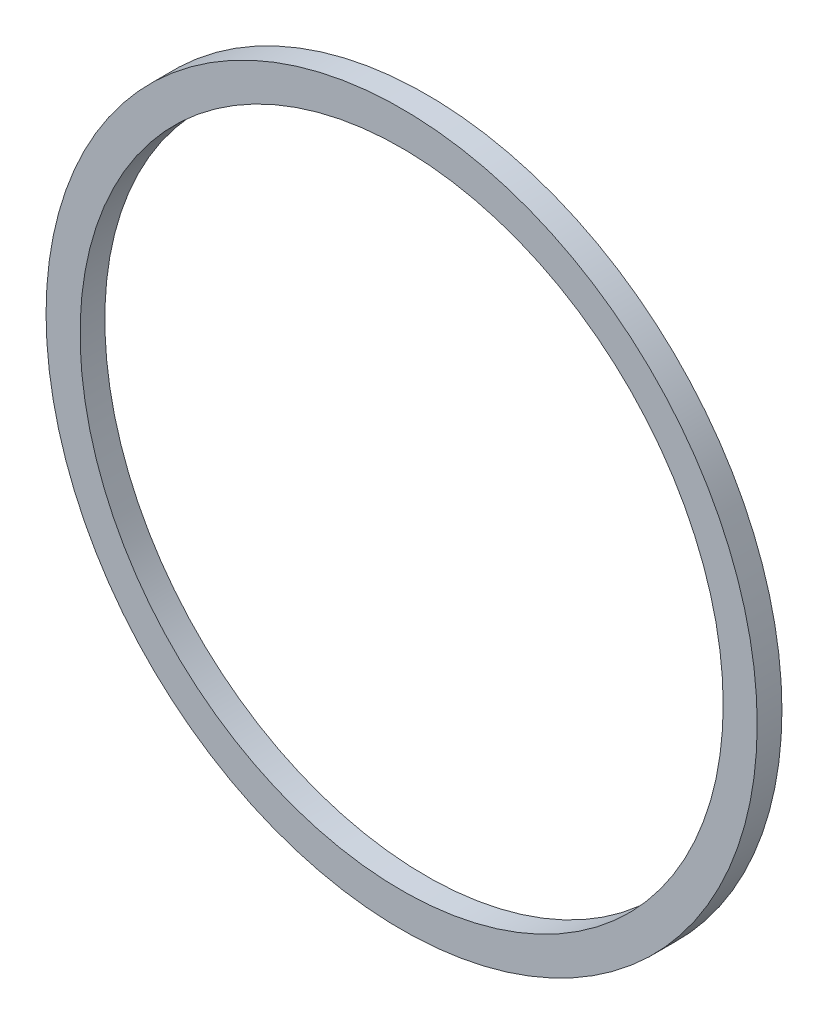
ISO-10303-21;
HEADER;
FILE_DESCRIPTION(('STEP AP214'),'2;1');
FILE_NAME('part.step','',(''),(''),'','','');
FILE_SCHEMA(('AUTOMOTIVE_DESIGN { 1 0 10303 214 1 1 1 1 }'));
ENDSEC;
DATA;
#1=APPLICATION_CONTEXT('core data for automotive mechanical design processes');
#2=APPLICATION_PROTOCOL_DEFINITION('international standard','automotive_design',2000,#1);
#3=PRODUCT_CONTEXT('',#1,'mechanical');
#4=PRODUCT('Part','Part','',(#3));
#5=PRODUCT_RELATED_PRODUCT_CATEGORY('part','',(#4));
#6=PRODUCT_DEFINITION_FORMATION('','',#4);
#7=PRODUCT_DEFINITION_CONTEXT('part definition',#1,'design');
#8=PRODUCT_DEFINITION('design','',#6,#7);
#9=PRODUCT_DEFINITION_SHAPE('','',#8);
#10=(LENGTH_UNIT() NAMED_UNIT(*) SI_UNIT(.MILLI.,.METRE.));
#11=(NAMED_UNIT(*) PLANE_ANGLE_UNIT() SI_UNIT($,.RADIAN.));
#12=(NAMED_UNIT(*) SI_UNIT($,.STERADIAN.) SOLID_ANGLE_UNIT());
#13=UNCERTAINTY_MEASURE_WITH_UNIT(LENGTH_MEASURE(1.E-05),#10,'distance_accuracy_value','');
#14=(GEOMETRIC_REPRESENTATION_CONTEXT(3) GLOBAL_UNCERTAINTY_ASSIGNED_CONTEXT((#13)) GLOBAL_UNIT_ASSIGNED_CONTEXT((#10,
#11,#12)) REPRESENTATION_CONTEXT('',''));
#15=CARTESIAN_POINT('',(0.,0.,0.));
#16=DIRECTION('',(0.,0.,1.));
#17=DIRECTION('',(1.,0.,0.));
#18=AXIS2_PLACEMENT_3D('',#15,#16,#17);
#19=CARTESIAN_POINT('',(0.,0.,0.5));
#20=DIRECTION('',(0.,0.,1.));
#21=DIRECTION('',(1.,0.,0.));
#22=AXIS2_PLACEMENT_3D('',#19,#20,#21);
#23=PLANE('',#22);
#24=CARTESIAN_POINT('',(0.,0.,0.5));
#25=DIRECTION('',(0.,0.,1.));
#26=DIRECTION('',(1.,0.,0.));
#27=AXIS2_PLACEMENT_3D('',#24,#25,#26);
#28=CIRCLE('',#27,7.18752863608637);
#29=CARTESIAN_POINT('',(7.18752863608637,0.,0.5));
#30=VERTEX_POINT('',#29);
#31=EDGE_CURVE('E10',#30,#30,#28,.T.);
#32=ORIENTED_EDGE('',*,*,#31,.T.);
#33=EDGE_LOOP('',(#32));
#34=FACE_BOUND('',#33,.T.);
#35=CARTESIAN_POINT('',(0.,0.,0.5));
#36=DIRECTION('',(0.,0.,1.));
#37=DIRECTION('',(1.,0.,0.));
#38=AXIS2_PLACEMENT_3D('',#35,#36,#37);
#39=CIRCLE('',#38,6.5);
#40=CARTESIAN_POINT('',(6.5,0.,0.5));
#41=VERTEX_POINT('',#40);
#42=EDGE_CURVE('E42',#41,#41,#39,.T.);
#43=ORIENTED_EDGE('',*,*,#42,.F.);
#44=EDGE_LOOP('',(#43));
#45=FACE_BOUND('',#44,.T.);
#46=ADVANCED_FACE('F31',(#34,#45),#23,.T.);
#47=CARTESIAN_POINT('',(0.,0.,0.));
#48=DIRECTION('',(0.,0.,1.));
#49=DIRECTION('',(1.,0.,0.));
#50=AXIS2_PLACEMENT_3D('',#47,#48,#49);
#51=PLANE('',#50);
#52=CARTESIAN_POINT('',(0.,0.,0.));
#53=DIRECTION('',(0.,0.,1.));
#54=DIRECTION('',(1.,0.,0.));
#55=AXIS2_PLACEMENT_3D('',#52,#53,#54);
#56=CIRCLE('',#55,7.18752863608637);
#57=CARTESIAN_POINT('',(7.18752863608637,0.,0.));
#58=VERTEX_POINT('',#57);
#59=EDGE_CURVE('E35',#58,#58,#56,.T.);
#60=ORIENTED_EDGE('',*,*,#59,.F.);
#61=EDGE_LOOP('',(#60));
#62=FACE_BOUND('',#61,.T.);
#63=CARTESIAN_POINT('',(0.,0.,0.));
#64=DIRECTION('',(0.,0.,1.));
#65=DIRECTION('',(1.,0.,0.));
#66=AXIS2_PLACEMENT_3D('',#63,#64,#65);
#67=CIRCLE('',#66,6.5);
#68=CARTESIAN_POINT('',(6.5,0.,0.));
#69=VERTEX_POINT('',#68);
#70=EDGE_CURVE('E44',#69,#69,#67,.T.);
#71=ORIENTED_EDGE('',*,*,#70,.T.);
#72=EDGE_LOOP('',(#71));
#73=FACE_BOUND('',#72,.T.);
#74=ADVANCED_FACE('F54',(#62,#73),#51,.F.);
#75=CARTESIAN_POINT('',(0.,0.,0.5));
#76=DIRECTION('',(0.,0.,-1.));
#77=DIRECTION('',(-1.,0.,0.));
#78=AXIS2_PLACEMENT_3D('',#75,#76,#77);
#79=CYLINDRICAL_SURFACE('',#78,7.18752863608637);
#80=ORIENTED_EDGE('',*,*,#31,.F.);
#81=EDGE_LOOP('',(#80));
#82=FACE_BOUND('',#81,.T.);
#83=ORIENTED_EDGE('',*,*,#59,.T.);
#84=EDGE_LOOP('',(#83));
#85=FACE_BOUND('',#84,.T.);
#86=ADVANCED_FACE('F33',(#82,#85),#79,.T.);
#87=CARTESIAN_POINT('',(0.,0.,0.5));
#88=DIRECTION('',(0.,0.,-1.));
#89=DIRECTION('',(-1.,0.,0.));
#90=AXIS2_PLACEMENT_3D('',#87,#88,#89);
#91=CYLINDRICAL_SURFACE('',#90,6.5);
#92=ORIENTED_EDGE('',*,*,#42,.T.);
#93=EDGE_LOOP('',(#92));
#94=FACE_BOUND('',#93,.T.);
#95=ORIENTED_EDGE('',*,*,#70,.F.);
#96=EDGE_LOOP('',(#95));
#97=FACE_BOUND('',#96,.T.);
#98=ADVANCED_FACE('F50',(#94,#97),#91,.F.);
#99=CLOSED_SHELL('',(#46,#74,#86,#98));
#100=MANIFOLD_SOLID_BREP('B2',#99);
#101=ADVANCED_BREP_SHAPE_REPRESENTATION('',(#18,#100),#14);
#102=SHAPE_DEFINITION_REPRESENTATION(#9,#101);
ENDSEC;
END-ISO-10303-21;
